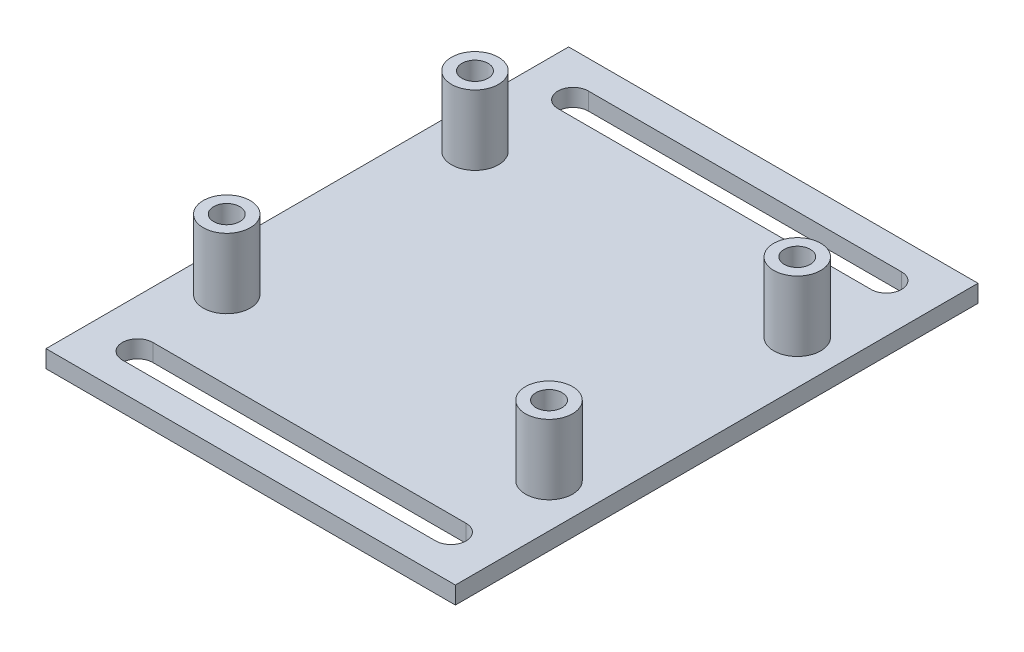
ISO-10303-21;
HEADER;
FILE_DESCRIPTION(('STEP AP214'),'2;1');
FILE_NAME('part.step','',(''),(''),'','','');
FILE_SCHEMA(('AUTOMOTIVE_DESIGN { 1 0 10303 214 1 1 1 1 }'));
ENDSEC;
DATA;
#1=APPLICATION_CONTEXT('core data for automotive mechanical design processes');
#2=APPLICATION_PROTOCOL_DEFINITION('international standard','automotive_design',2000,#1);
#3=PRODUCT_CONTEXT('',#1,'mechanical');
#4=PRODUCT('Part','Part','',(#3));
#5=PRODUCT_RELATED_PRODUCT_CATEGORY('part','',(#4));
#6=PRODUCT_DEFINITION_FORMATION('','',#4);
#7=PRODUCT_DEFINITION_CONTEXT('part definition',#1,'design');
#8=PRODUCT_DEFINITION('design','',#6,#7);
#9=PRODUCT_DEFINITION_SHAPE('','',#8);
#10=(LENGTH_UNIT() NAMED_UNIT(*) SI_UNIT(.MILLI.,.METRE.));
#11=(NAMED_UNIT(*) PLANE_ANGLE_UNIT() SI_UNIT($,.RADIAN.));
#12=(NAMED_UNIT(*) SI_UNIT($,.STERADIAN.) SOLID_ANGLE_UNIT());
#13=UNCERTAINTY_MEASURE_WITH_UNIT(LENGTH_MEASURE(1.E-05),#10,'distance_accuracy_value','');
#14=(GEOMETRIC_REPRESENTATION_CONTEXT(3) GLOBAL_UNCERTAINTY_ASSIGNED_CONTEXT((#13)) GLOBAL_UNIT_ASSIGNED_CONTEXT((#10,
#11,#12)) REPRESENTATION_CONTEXT('',''));
#15=CARTESIAN_POINT('',(0.,0.,0.));
#16=DIRECTION('',(0.,0.,1.));
#17=DIRECTION('',(1.,0.,0.));
#18=AXIS2_PLACEMENT_3D('',#15,#16,#17);
#19=CARTESIAN_POINT('',(0.,2.,0.));
#20=DIRECTION('',(0.,1.,0.));
#21=DIRECTION('',(0.,0.,1.));
#22=AXIS2_PLACEMENT_3D('',#19,#20,#21);
#23=PLANE('',#22);
#24=CARTESIAN_POINT('',(-18.5,2.,14.25));
#25=DIRECTION('',(0.,1.,0.));
#26=DIRECTION('',(0.,0.,1.));
#27=AXIS2_PLACEMENT_3D('',#24,#25,#26);
#28=CIRCLE('',#27,2.7);
#29=CARTESIAN_POINT('',(-18.5,2.,16.95));
#30=VERTEX_POINT('',#29);
#31=EDGE_CURVE('E531',#30,#30,#28,.T.);
#32=ORIENTED_EDGE('',*,*,#31,.F.);
#33=EDGE_LOOP('',(#32));
#34=FACE_BOUND('',#33,.T.);
#35=CARTESIAN_POINT('',(18.5,2.,14.25));
#36=DIRECTION('',(0.,1.,0.));
#37=DIRECTION('',(0.,0.,1.));
#38=AXIS2_PLACEMENT_3D('',#35,#36,#37);
#39=CIRCLE('',#38,2.7);
#40=CARTESIAN_POINT('',(18.5,2.,16.95));
#41=VERTEX_POINT('',#40);
#42=EDGE_CURVE('E542',#41,#41,#39,.T.);
#43=ORIENTED_EDGE('',*,*,#42,.F.);
#44=EDGE_LOOP('',(#43));
#45=FACE_BOUND('',#44,.T.);
#46=CARTESIAN_POINT('',(18.5,2.,-14.25));
#47=DIRECTION('',(0.,1.,0.));
#48=DIRECTION('',(0.,0.,1.));
#49=AXIS2_PLACEMENT_3D('',#46,#47,#48);
#50=CIRCLE('',#49,2.7);
#51=CARTESIAN_POINT('',(18.5,2.,-11.55));
#52=VERTEX_POINT('',#51);
#53=EDGE_CURVE('E551',#52,#52,#50,.T.);
#54=ORIENTED_EDGE('',*,*,#53,.F.);
#55=EDGE_LOOP('',(#54));
#56=FACE_BOUND('',#55,.T.);
#57=CARTESIAN_POINT('',(-18.5,2.,-14.25));
#58=DIRECTION('',(0.,1.,0.));
#59=DIRECTION('',(0.,0.,1.));
#60=AXIS2_PLACEMENT_3D('',#57,#58,#59);
#61=CIRCLE('',#60,2.7);
#62=CARTESIAN_POINT('',(-18.5,2.,-11.55));
#63=VERTEX_POINT('',#62);
#64=EDGE_CURVE('E559',#63,#63,#61,.T.);
#65=ORIENTED_EDGE('',*,*,#64,.F.);
#66=EDGE_LOOP('',(#65));
#67=FACE_BOUND('',#66,.T.);
#68=DIRECTION('',(0.,0.,-1.));
#69=VECTOR('',#68,1.);
#70=CARTESIAN_POINT('',(23.5,2.,-30.));
#71=LINE('',#70,#69);
#72=CARTESIAN_POINT('',(23.5,2.,30.));
#73=VERTEX_POINT('',#72);
#74=CARTESIAN_POINT('',(23.5,2.,-30.));
#75=VERTEX_POINT('',#74);
#76=EDGE_CURVE('E191',#73,#75,#71,.T.);
#77=ORIENTED_EDGE('',*,*,#76,.T.);
#78=DIRECTION('',(-1.,0.,0.));
#79=VECTOR('',#78,1.);
#80=CARTESIAN_POINT('',(-23.5,2.,-30.));
#81=LINE('',#80,#79);
#82=CARTESIAN_POINT('',(-23.5,2.,-30.));
#83=VERTEX_POINT('',#82);
#84=EDGE_CURVE('E194',#75,#83,#81,.T.);
#85=ORIENTED_EDGE('',*,*,#84,.T.);
#86=DIRECTION('',(0.,0.,1.));
#87=VECTOR('',#86,1.);
#88=CARTESIAN_POINT('',(-23.5,2.,-30.));
#89=LINE('',#88,#87);
#90=CARTESIAN_POINT('',(-23.5,2.,30.));
#91=VERTEX_POINT('',#90);
#92=EDGE_CURVE('E197',#83,#91,#89,.T.);
#93=ORIENTED_EDGE('',*,*,#92,.T.);
#94=DIRECTION('',(1.,0.,0.));
#95=VECTOR('',#94,1.);
#96=CARTESIAN_POINT('',(-23.5,2.,30.));
#97=LINE('',#96,#95);
#98=EDGE_CURVE('E199',#91,#73,#97,.T.);
#99=ORIENTED_EDGE('',*,*,#98,.T.);
#100=EDGE_LOOP('',(#77,#85,#93,#99));
#101=FACE_BOUND('',#100,.T.);
#102=DIRECTION('',(1.,0.,0.));
#103=VECTOR('',#102,1.);
#104=CARTESIAN_POINT('',(-17.9824098704289,2.,-23.25));
#105=LINE('',#104,#103);
#106=CARTESIAN_POINT('',(-17.9824098704289,2.,-23.25));
#107=VERTEX_POINT('',#106);
#108=CARTESIAN_POINT('',(17.9824098704289,2.,-23.25));
#109=VERTEX_POINT('',#108);
#110=EDGE_CURVE('E162',#107,#109,#105,.T.);
#111=ORIENTED_EDGE('',*,*,#110,.F.);
#112=CARTESIAN_POINT('',(-17.9824098704289,2.,-25.));
#113=DIRECTION('',(0.,1.,0.));
#114=DIRECTION('',(0.,0.,1.));
#115=AXIS2_PLACEMENT_3D('',#112,#113,#114);
#116=CIRCLE('',#115,1.75);
#117=CARTESIAN_POINT('',(-17.9824098704289,2.,-26.75));
#118=VERTEX_POINT('',#117);
#119=EDGE_CURVE('E160',#118,#107,#116,.T.);
#120=ORIENTED_EDGE('',*,*,#119,.F.);
#121=DIRECTION('',(-1.,0.,0.));
#122=VECTOR('',#121,1.);
#123=CARTESIAN_POINT('',(-17.9824098704289,2.,-26.75));
#124=LINE('',#123,#122);
#125=CARTESIAN_POINT('',(17.9824098704289,2.,-26.75));
#126=VERTEX_POINT('',#125);
#127=EDGE_CURVE('E168',#126,#118,#124,.T.);
#128=ORIENTED_EDGE('',*,*,#127,.F.);
#129=CARTESIAN_POINT('',(17.9824098704289,2.,-25.));
#130=DIRECTION('',(0.,1.,0.));
#131=DIRECTION('',(0.,0.,1.));
#132=AXIS2_PLACEMENT_3D('',#129,#130,#131);
#133=CIRCLE('',#132,1.75);
#134=EDGE_CURVE('E165',#109,#126,#133,.T.);
#135=ORIENTED_EDGE('',*,*,#134,.F.);
#136=EDGE_LOOP('',(#111,#120,#128,#135));
#137=FACE_BOUND('',#136,.T.);
#138=DIRECTION('',(1.,0.,0.));
#139=VECTOR('',#138,1.);
#140=CARTESIAN_POINT('',(-17.9824098704289,2.,26.75));
#141=LINE('',#140,#139);
#142=CARTESIAN_POINT('',(-17.9824098704289,2.,26.75));
#143=VERTEX_POINT('',#142);
#144=CARTESIAN_POINT('',(17.9824098704289,2.,26.75));
#145=VERTEX_POINT('',#144);
#146=EDGE_CURVE('E130',#143,#145,#141,.T.);
#147=ORIENTED_EDGE('',*,*,#146,.F.);
#148=CARTESIAN_POINT('',(-17.9824098704289,2.,25.));
#149=DIRECTION('',(0.,1.,0.));
#150=DIRECTION('',(0.,0.,1.));
#151=AXIS2_PLACEMENT_3D('',#148,#149,#150);
#152=CIRCLE('',#151,1.75);
#153=CARTESIAN_POINT('',(-17.9824098704289,2.,23.25));
#154=VERTEX_POINT('',#153);
#155=EDGE_CURVE('E122',#154,#143,#152,.T.);
#156=ORIENTED_EDGE('',*,*,#155,.F.);
#157=DIRECTION('',(-1.,0.,0.));
#158=VECTOR('',#157,1.);
#159=CARTESIAN_POINT('',(-17.9824098704289,2.,23.25));
#160=LINE('',#159,#158);
#161=CARTESIAN_POINT('',(17.9824098704289,2.,23.25));
#162=VERTEX_POINT('',#161);
#163=EDGE_CURVE('E144',#162,#154,#160,.T.);
#164=ORIENTED_EDGE('',*,*,#163,.F.);
#165=CARTESIAN_POINT('',(17.9824098704289,2.,25.));
#166=DIRECTION('',(0.,1.,0.));
#167=DIRECTION('',(0.,0.,1.));
#168=AXIS2_PLACEMENT_3D('',#165,#166,#167);
#169=CIRCLE('',#168,1.75);
#170=EDGE_CURVE('E142',#145,#162,#169,.T.);
#171=ORIENTED_EDGE('',*,*,#170,.F.);
#172=EDGE_LOOP('',(#147,#156,#164,#171));
#173=FACE_BOUND('',#172,.T.);
#174=ADVANCED_FACE('F33',(#34,#45,#56,#67,#101,#137,#173),#23,.T.);
#175=CARTESIAN_POINT('',(0.,0.,0.));
#176=DIRECTION('',(0.,1.,0.));
#177=DIRECTION('',(0.,0.,1.));
#178=AXIS2_PLACEMENT_3D('',#175,#176,#177);
#179=PLANE('',#178);
#180=CARTESIAN_POINT('',(-17.9824098704289,0.,-25.));
#181=DIRECTION('',(0.,1.,0.));
#182=DIRECTION('',(0.,0.,1.));
#183=AXIS2_PLACEMENT_3D('',#180,#181,#182);
#184=CIRCLE('',#183,1.75);
#185=CARTESIAN_POINT('',(-17.9824098704289,0.,-26.75));
#186=VERTEX_POINT('',#185);
#187=CARTESIAN_POINT('',(-17.9824098704289,0.,-23.25));
#188=VERTEX_POINT('',#187);
#189=EDGE_CURVE('E138',#186,#188,#184,.T.);
#190=ORIENTED_EDGE('',*,*,#189,.T.);
#191=DIRECTION('',(1.,0.,0.));
#192=VECTOR('',#191,1.);
#193=CARTESIAN_POINT('',(-17.9824098704289,0.,-23.25));
#194=LINE('',#193,#192);
#195=CARTESIAN_POINT('',(17.9824098704289,0.,-23.25));
#196=VERTEX_POINT('',#195);
#197=EDGE_CURVE('E173',#188,#196,#194,.T.);
#198=ORIENTED_EDGE('',*,*,#197,.T.);
#199=CARTESIAN_POINT('',(17.9824098704289,0.,-25.));
#200=DIRECTION('',(0.,1.,0.));
#201=DIRECTION('',(0.,0.,1.));
#202=AXIS2_PLACEMENT_3D('',#199,#200,#201);
#203=CIRCLE('',#202,1.75);
#204=CARTESIAN_POINT('',(17.9824098704289,0.,-26.75));
#205=VERTEX_POINT('',#204);
#206=EDGE_CURVE('E176',#196,#205,#203,.T.);
#207=ORIENTED_EDGE('',*,*,#206,.T.);
#208=DIRECTION('',(-1.,0.,0.));
#209=VECTOR('',#208,1.);
#210=CARTESIAN_POINT('',(-17.9824098704289,0.,-26.75));
#211=LINE('',#210,#209);
#212=EDGE_CURVE('E163',#205,#186,#211,.T.);
#213=ORIENTED_EDGE('',*,*,#212,.T.);
#214=EDGE_LOOP('',(#190,#198,#207,#213));
#215=FACE_BOUND('',#214,.T.);
#216=DIRECTION('',(0.,0.,-1.));
#217=VECTOR('',#216,1.);
#218=CARTESIAN_POINT('',(23.5,0.,-30.));
#219=LINE('',#218,#217);
#220=CARTESIAN_POINT('',(23.5,0.,30.));
#221=VERTEX_POINT('',#220);
#222=CARTESIAN_POINT('',(23.5,0.,-30.));
#223=VERTEX_POINT('',#222);
#224=EDGE_CURVE('E190',#221,#223,#219,.T.);
#225=ORIENTED_EDGE('',*,*,#224,.F.);
#226=DIRECTION('',(1.,0.,0.));
#227=VECTOR('',#226,1.);
#228=CARTESIAN_POINT('',(-23.5,0.,30.));
#229=LINE('',#228,#227);
#230=CARTESIAN_POINT('',(-23.5,0.,30.));
#231=VERTEX_POINT('',#230);
#232=EDGE_CURVE('E195',#231,#221,#229,.T.);
#233=ORIENTED_EDGE('',*,*,#232,.F.);
#234=DIRECTION('',(0.,0.,1.));
#235=VECTOR('',#234,1.);
#236=CARTESIAN_POINT('',(-23.5,0.,-30.));
#237=LINE('',#236,#235);
#238=CARTESIAN_POINT('',(-23.5,0.,-30.));
#239=VERTEX_POINT('',#238);
#240=EDGE_CURVE('E206',#239,#231,#237,.T.);
#241=ORIENTED_EDGE('',*,*,#240,.F.);
#242=DIRECTION('',(-1.,0.,0.));
#243=VECTOR('',#242,1.);
#244=CARTESIAN_POINT('',(-23.5,0.,-30.));
#245=LINE('',#244,#243);
#246=EDGE_CURVE('E204',#223,#239,#245,.T.);
#247=ORIENTED_EDGE('',*,*,#246,.F.);
#248=EDGE_LOOP('',(#225,#233,#241,#247));
#249=FACE_BOUND('',#248,.T.);
#250=CARTESIAN_POINT('',(-17.9824098704289,0.,25.));
#251=DIRECTION('',(0.,1.,0.));
#252=DIRECTION('',(0.,0.,1.));
#253=AXIS2_PLACEMENT_3D('',#250,#251,#252);
#254=CIRCLE('',#253,1.75);
#255=CARTESIAN_POINT('',(-17.9824098704289,0.,23.25));
#256=VERTEX_POINT('',#255);
#257=CARTESIAN_POINT('',(-17.9824098704289,0.,26.75));
#258=VERTEX_POINT('',#257);
#259=EDGE_CURVE('E56',#256,#258,#254,.T.);
#260=ORIENTED_EDGE('',*,*,#259,.T.);
#261=DIRECTION('',(1.,0.,0.));
#262=VECTOR('',#261,1.);
#263=CARTESIAN_POINT('',(-17.9824098704289,0.,26.75));
#264=LINE('',#263,#262);
#265=CARTESIAN_POINT('',(17.9824098704289,0.,26.75));
#266=VERTEX_POINT('',#265);
#267=EDGE_CURVE('E137',#258,#266,#264,.T.);
#268=ORIENTED_EDGE('',*,*,#267,.T.);
#269=CARTESIAN_POINT('',(17.9824098704289,0.,25.));
#270=DIRECTION('',(0.,1.,0.));
#271=DIRECTION('',(0.,0.,1.));
#272=AXIS2_PLACEMENT_3D('',#269,#270,#271);
#273=CIRCLE('',#272,1.75);
#274=CARTESIAN_POINT('',(17.9824098704289,0.,23.25));
#275=VERTEX_POINT('',#274);
#276=EDGE_CURVE('E152',#266,#275,#273,.T.);
#277=ORIENTED_EDGE('',*,*,#276,.T.);
#278=DIRECTION('',(-1.,0.,0.));
#279=VECTOR('',#278,1.);
#280=CARTESIAN_POINT('',(-17.9824098704289,0.,23.25));
#281=LINE('',#280,#279);
#282=EDGE_CURVE('E131',#275,#256,#281,.T.);
#283=ORIENTED_EDGE('',*,*,#282,.T.);
#284=EDGE_LOOP('',(#260,#268,#277,#283));
#285=FACE_BOUND('',#284,.T.);
#286=ADVANCED_FACE('F257',(#215,#249,#285),#179,.F.);
#287=CARTESIAN_POINT('',(23.5,2.,-30.));
#288=DIRECTION('',(-1.,0.,0.));
#289=DIRECTION('',(0.,0.,1.));
#290=AXIS2_PLACEMENT_3D('',#287,#288,#289);
#291=PLANE('',#290);
#292=ORIENTED_EDGE('',*,*,#224,.T.);
#293=DIRECTION('',(0.,-1.,0.));
#294=VECTOR('',#293,1.);
#295=CARTESIAN_POINT('',(23.5,2.,-30.));
#296=LINE('',#295,#294);
#297=EDGE_CURVE('E217',#75,#223,#296,.T.);
#298=ORIENTED_EDGE('',*,*,#297,.F.);
#299=ORIENTED_EDGE('',*,*,#76,.F.);
#300=DIRECTION('',(0.,-1.,0.));
#301=VECTOR('',#300,1.);
#302=CARTESIAN_POINT('',(23.5,2.,30.));
#303=LINE('',#302,#301);
#304=EDGE_CURVE('E201',#73,#221,#303,.T.);
#305=ORIENTED_EDGE('',*,*,#304,.T.);
#306=EDGE_LOOP('',(#292,#298,#299,#305));
#307=FACE_BOUND('',#306,.T.);
#308=ADVANCED_FACE('F35',(#307),#291,.F.);
#309=CARTESIAN_POINT('',(-23.5,2.,-30.));
#310=DIRECTION('',(0.,0.,1.));
#311=DIRECTION('',(1.,0.,0.));
#312=AXIS2_PLACEMENT_3D('',#309,#310,#311);
#313=PLANE('',#312);
#314=ORIENTED_EDGE('',*,*,#246,.T.);
#315=DIRECTION('',(0.,-1.,0.));
#316=VECTOR('',#315,1.);
#317=CARTESIAN_POINT('',(-23.5,2.,-30.));
#318=LINE('',#317,#316);
#319=EDGE_CURVE('E214',#83,#239,#318,.T.);
#320=ORIENTED_EDGE('',*,*,#319,.F.);
#321=ORIENTED_EDGE('',*,*,#84,.F.);
#322=ORIENTED_EDGE('',*,*,#297,.T.);
#323=EDGE_LOOP('',(#314,#320,#321,#322));
#324=FACE_BOUND('',#323,.T.);
#325=ADVANCED_FACE('F351',(#324),#313,.F.);
#326=CARTESIAN_POINT('',(-23.5,2.,-30.));
#327=DIRECTION('',(1.,0.,0.));
#328=DIRECTION('',(0.,0.,-1.));
#329=AXIS2_PLACEMENT_3D('',#326,#327,#328);
#330=PLANE('',#329);
#331=ORIENTED_EDGE('',*,*,#240,.T.);
#332=DIRECTION('',(0.,-1.,0.));
#333=VECTOR('',#332,1.);
#334=CARTESIAN_POINT('',(-23.5,2.,30.));
#335=LINE('',#334,#333);
#336=EDGE_CURVE('E211',#91,#231,#335,.T.);
#337=ORIENTED_EDGE('',*,*,#336,.F.);
#338=ORIENTED_EDGE('',*,*,#92,.F.);
#339=ORIENTED_EDGE('',*,*,#319,.T.);
#340=EDGE_LOOP('',(#331,#337,#338,#339));
#341=FACE_BOUND('',#340,.T.);
#342=ADVANCED_FACE('F322',(#341),#330,.F.);
#343=CARTESIAN_POINT('',(-23.5,2.,30.));
#344=DIRECTION('',(0.,0.,-1.));
#345=DIRECTION('',(-1.,0.,0.));
#346=AXIS2_PLACEMENT_3D('',#343,#344,#345);
#347=PLANE('',#346);
#348=ORIENTED_EDGE('',*,*,#232,.T.);
#349=ORIENTED_EDGE('',*,*,#304,.F.);
#350=ORIENTED_EDGE('',*,*,#98,.F.);
#351=ORIENTED_EDGE('',*,*,#336,.T.);
#352=EDGE_LOOP('',(#348,#349,#350,#351));
#353=FACE_BOUND('',#352,.T.);
#354=ADVANCED_FACE('F317',(#353),#347,.F.);
#355=CARTESIAN_POINT('',(-17.9824098704289,2.,-25.));
#356=DIRECTION('',(0.,-1.,0.));
#357=DIRECTION('',(0.,0.,-1.));
#358=AXIS2_PLACEMENT_3D('',#355,#356,#357);
#359=CYLINDRICAL_SURFACE('',#358,1.75);
#360=ORIENTED_EDGE('',*,*,#189,.F.);
#361=DIRECTION('',(0.,-1.,0.));
#362=VECTOR('',#361,1.);
#363=CARTESIAN_POINT('',(-17.9824098704289,2.,-26.75));
#364=LINE('',#363,#362);
#365=EDGE_CURVE('E170',#118,#186,#364,.T.);
#366=ORIENTED_EDGE('',*,*,#365,.F.);
#367=ORIENTED_EDGE('',*,*,#119,.T.);
#368=DIRECTION('',(0.,-1.,0.));
#369=VECTOR('',#368,1.);
#370=CARTESIAN_POINT('',(-17.9824098704289,2.,-23.25));
#371=LINE('',#370,#369);
#372=EDGE_CURVE('E187',#107,#188,#371,.T.);
#373=ORIENTED_EDGE('',*,*,#372,.T.);
#374=EDGE_LOOP('',(#360,#366,#367,#373));
#375=FACE_BOUND('',#374,.T.);
#376=ADVANCED_FACE('F314',(#375),#359,.F.);
#377=CARTESIAN_POINT('',(-17.9824098704289,2.,-23.25));
#378=DIRECTION('',(0.,0.,-1.));
#379=DIRECTION('',(-1.,0.,0.));
#380=AXIS2_PLACEMENT_3D('',#377,#378,#379);
#381=PLANE('',#380);
#382=ORIENTED_EDGE('',*,*,#197,.F.);
#383=ORIENTED_EDGE('',*,*,#372,.F.);
#384=ORIENTED_EDGE('',*,*,#110,.T.);
#385=DIRECTION('',(0.,-1.,0.));
#386=VECTOR('',#385,1.);
#387=CARTESIAN_POINT('',(17.9824098704289,2.,-23.25));
#388=LINE('',#387,#386);
#389=EDGE_CURVE('E185',#109,#196,#388,.T.);
#390=ORIENTED_EDGE('',*,*,#389,.T.);
#391=EDGE_LOOP('',(#382,#383,#384,#390));
#392=FACE_BOUND('',#391,.T.);
#393=ADVANCED_FACE('F311',(#392),#381,.T.);
#394=CARTESIAN_POINT('',(17.9824098704289,2.,-25.));
#395=DIRECTION('',(0.,-1.,0.));
#396=DIRECTION('',(0.,0.,-1.));
#397=AXIS2_PLACEMENT_3D('',#394,#395,#396);
#398=CYLINDRICAL_SURFACE('',#397,1.75);
#399=ORIENTED_EDGE('',*,*,#206,.F.);
#400=ORIENTED_EDGE('',*,*,#389,.F.);
#401=ORIENTED_EDGE('',*,*,#134,.T.);
#402=DIRECTION('',(0.,-1.,0.));
#403=VECTOR('',#402,1.);
#404=CARTESIAN_POINT('',(17.9824098704289,2.,-26.75));
#405=LINE('',#404,#403);
#406=EDGE_CURVE('E183',#126,#205,#405,.T.);
#407=ORIENTED_EDGE('',*,*,#406,.T.);
#408=EDGE_LOOP('',(#399,#400,#401,#407));
#409=FACE_BOUND('',#408,.T.);
#410=ADVANCED_FACE('F307',(#409),#398,.F.);
#411=CARTESIAN_POINT('',(-17.9824098704289,2.,-26.75));
#412=DIRECTION('',(0.,0.,1.));
#413=DIRECTION('',(1.,0.,0.));
#414=AXIS2_PLACEMENT_3D('',#411,#412,#413);
#415=PLANE('',#414);
#416=ORIENTED_EDGE('',*,*,#212,.F.);
#417=ORIENTED_EDGE('',*,*,#406,.F.);
#418=ORIENTED_EDGE('',*,*,#127,.T.);
#419=ORIENTED_EDGE('',*,*,#365,.T.);
#420=EDGE_LOOP('',(#416,#417,#418,#419));
#421=FACE_BOUND('',#420,.T.);
#422=ADVANCED_FACE('F304',(#421),#415,.T.);
#423=CARTESIAN_POINT('',(-17.9824098704289,2.,25.));
#424=DIRECTION('',(0.,-1.,0.));
#425=DIRECTION('',(0.,0.,-1.));
#426=AXIS2_PLACEMENT_3D('',#423,#424,#425);
#427=CYLINDRICAL_SURFACE('',#426,1.75);
#428=ORIENTED_EDGE('',*,*,#259,.F.);
#429=DIRECTION('',(0.,-1.,0.));
#430=VECTOR('',#429,1.);
#431=CARTESIAN_POINT('',(-17.9824098704289,2.,23.25));
#432=LINE('',#431,#430);
#433=EDGE_CURVE('E126',#154,#256,#432,.T.);
#434=ORIENTED_EDGE('',*,*,#433,.F.);
#435=ORIENTED_EDGE('',*,*,#155,.T.);
#436=DIRECTION('',(0.,-1.,0.));
#437=VECTOR('',#436,1.);
#438=CARTESIAN_POINT('',(-17.9824098704289,2.,26.75));
#439=LINE('',#438,#437);
#440=EDGE_CURVE('E125',#143,#258,#439,.T.);
#441=ORIENTED_EDGE('',*,*,#440,.T.);
#442=EDGE_LOOP('',(#428,#434,#435,#441));
#443=FACE_BOUND('',#442,.T.);
#444=ADVANCED_FACE('F124',(#443),#427,.F.);
#445=CARTESIAN_POINT('',(-17.9824098704289,2.,26.75));
#446=DIRECTION('',(0.,0.,-1.));
#447=DIRECTION('',(-1.,0.,0.));
#448=AXIS2_PLACEMENT_3D('',#445,#446,#447);
#449=PLANE('',#448);
#450=ORIENTED_EDGE('',*,*,#267,.F.);
#451=ORIENTED_EDGE('',*,*,#440,.F.);
#452=ORIENTED_EDGE('',*,*,#146,.T.);
#453=DIRECTION('',(0.,-1.,0.));
#454=VECTOR('',#453,1.);
#455=CARTESIAN_POINT('',(17.9824098704289,2.,26.75));
#456=LINE('',#455,#454);
#457=EDGE_CURVE('E139',#145,#266,#456,.T.);
#458=ORIENTED_EDGE('',*,*,#457,.T.);
#459=EDGE_LOOP('',(#450,#451,#452,#458));
#460=FACE_BOUND('',#459,.T.);
#461=ADVANCED_FACE('F134',(#460),#449,.T.);
#462=CARTESIAN_POINT('',(17.9824098704289,2.,25.));
#463=DIRECTION('',(0.,-1.,0.));
#464=DIRECTION('',(0.,0.,-1.));
#465=AXIS2_PLACEMENT_3D('',#462,#463,#464);
#466=CYLINDRICAL_SURFACE('',#465,1.75);
#467=ORIENTED_EDGE('',*,*,#276,.F.);
#468=ORIENTED_EDGE('',*,*,#457,.F.);
#469=ORIENTED_EDGE('',*,*,#170,.T.);
#470=DIRECTION('',(0.,-1.,0.));
#471=VECTOR('',#470,1.);
#472=CARTESIAN_POINT('',(17.9824098704289,2.,23.25));
#473=LINE('',#472,#471);
#474=EDGE_CURVE('E48',#162,#275,#473,.T.);
#475=ORIENTED_EDGE('',*,*,#474,.T.);
#476=EDGE_LOOP('',(#467,#468,#469,#475));
#477=FACE_BOUND('',#476,.T.);
#478=ADVANCED_FACE('F296',(#477),#466,.F.);
#479=CARTESIAN_POINT('',(-17.9824098704289,2.,23.25));
#480=DIRECTION('',(0.,0.,1.));
#481=DIRECTION('',(1.,0.,0.));
#482=AXIS2_PLACEMENT_3D('',#479,#480,#481);
#483=PLANE('',#482);
#484=ORIENTED_EDGE('',*,*,#282,.F.);
#485=ORIENTED_EDGE('',*,*,#474,.F.);
#486=ORIENTED_EDGE('',*,*,#163,.T.);
#487=ORIENTED_EDGE('',*,*,#433,.T.);
#488=EDGE_LOOP('',(#484,#485,#486,#487));
#489=FACE_BOUND('',#488,.T.);
#490=ADVANCED_FACE('F291',(#489),#483,.T.);
#491=CARTESIAN_POINT('',(-18.5,10.,-14.25));
#492=DIRECTION('',(0.,1.,0.));
#493=DIRECTION('',(0.,0.,1.));
#494=AXIS2_PLACEMENT_3D('',#491,#492,#493);
#495=PLANE('',#494);
#496=CARTESIAN_POINT('',(-18.5,10.,-14.25));
#497=DIRECTION('',(0.,1.,0.));
#498=DIRECTION('',(0.,0.,1.));
#499=AXIS2_PLACEMENT_3D('',#496,#497,#498);
#500=CIRCLE('',#499,2.7);
#501=CARTESIAN_POINT('',(-18.5,10.,-11.55));
#502=VERTEX_POINT('',#501);
#503=EDGE_CURVE('E150',#502,#502,#500,.T.);
#504=ORIENTED_EDGE('',*,*,#503,.T.);
#505=EDGE_LOOP('',(#504));
#506=FACE_BOUND('',#505,.T.);
#507=CARTESIAN_POINT('',(-18.5,10.,-14.25));
#508=DIRECTION('',(0.,1.,0.));
#509=DIRECTION('',(0.,0.,1.));
#510=AXIS2_PLACEMENT_3D('',#507,#508,#509);
#511=CIRCLE('',#510,1.5);
#512=CARTESIAN_POINT('',(-18.5,10.,-12.75));
#513=VERTEX_POINT('',#512);
#514=EDGE_CURVE('E555',#513,#513,#511,.T.);
#515=ORIENTED_EDGE('',*,*,#514,.F.);
#516=EDGE_LOOP('',(#515));
#517=FACE_BOUND('',#516,.T.);
#518=ADVANCED_FACE('F284',(#506,#517),#495,.T.);
#519=CARTESIAN_POINT('',(-18.5,10.,-14.25));
#520=DIRECTION('',(0.,-1.,0.));
#521=DIRECTION('',(0.,0.,-1.));
#522=AXIS2_PLACEMENT_3D('',#519,#520,#521);
#523=CYLINDRICAL_SURFACE('',#522,2.7);
#524=ORIENTED_EDGE('',*,*,#503,.F.);
#525=EDGE_LOOP('',(#524));
#526=FACE_BOUND('',#525,.T.);
#527=ORIENTED_EDGE('',*,*,#64,.T.);
#528=EDGE_LOOP('',(#527));
#529=FACE_BOUND('',#528,.T.);
#530=ADVANCED_FACE('F276',(#526,#529),#523,.T.);
#531=CARTESIAN_POINT('',(-18.5,10.,-14.25));
#532=DIRECTION('',(0.,-1.,0.));
#533=DIRECTION('',(0.,0.,-1.));
#534=AXIS2_PLACEMENT_3D('',#531,#532,#533);
#535=CYLINDRICAL_SURFACE('',#534,1.5);
#536=ORIENTED_EDGE('',*,*,#514,.T.);
#537=EDGE_LOOP('',(#536));
#538=FACE_BOUND('',#537,.T.);
#539=CARTESIAN_POINT('',(-18.5,2.,-14.25));
#540=DIRECTION('',(0.,1.,0.));
#541=DIRECTION('',(0.,0.,1.));
#542=AXIS2_PLACEMENT_3D('',#539,#540,#541);
#543=CIRCLE('',#542,1.5);
#544=CARTESIAN_POINT('',(-18.5,2.,-12.75));
#545=VERTEX_POINT('',#544);
#546=EDGE_CURVE('E220',#545,#545,#543,.F.);
#547=ORIENTED_EDGE('',*,*,#546,.T.);
#548=EDGE_LOOP('',(#547));
#549=FACE_BOUND('',#548,.T.);
#550=ADVANCED_FACE('F267',(#538,#549),#535,.F.);
#551=ORIENTED_EDGE('',*,*,#546,.F.);
#552=EDGE_LOOP('',(#551));
#553=FACE_BOUND('',#552,.T.);
#554=ADVANCED_FACE('F252',(#553),#23,.T.);
#555=CARTESIAN_POINT('',(18.5,10.,-14.25));
#556=DIRECTION('',(0.,1.,0.));
#557=DIRECTION('',(0.,0.,1.));
#558=AXIS2_PLACEMENT_3D('',#555,#556,#557);
#559=PLANE('',#558);
#560=CARTESIAN_POINT('',(18.5,10.,-14.25));
#561=DIRECTION('',(0.,1.,0.));
#562=DIRECTION('',(0.,0.,1.));
#563=AXIS2_PLACEMENT_3D('',#560,#561,#562);
#564=CIRCLE('',#563,2.7);
#565=CARTESIAN_POINT('',(18.5,10.,-11.55));
#566=VERTEX_POINT('',#565);
#567=EDGE_CURVE('E552',#566,#566,#564,.T.);
#568=ORIENTED_EDGE('',*,*,#567,.T.);
#569=EDGE_LOOP('',(#568));
#570=FACE_BOUND('',#569,.T.);
#571=CARTESIAN_POINT('',(18.5,10.,-14.25));
#572=DIRECTION('',(0.,1.,0.));
#573=DIRECTION('',(0.,0.,1.));
#574=AXIS2_PLACEMENT_3D('',#571,#572,#573);
#575=CIRCLE('',#574,1.5);
#576=CARTESIAN_POINT('',(18.5,10.,-12.75));
#577=VERTEX_POINT('',#576);
#578=EDGE_CURVE('E546',#577,#577,#575,.T.);
#579=ORIENTED_EDGE('',*,*,#578,.F.);
#580=EDGE_LOOP('',(#579));
#581=FACE_BOUND('',#580,.T.);
#582=ADVANCED_FACE('F266',(#570,#581),#559,.T.);
#583=CARTESIAN_POINT('',(18.5,10.,-14.25));
#584=DIRECTION('',(0.,-1.,0.));
#585=DIRECTION('',(0.,0.,-1.));
#586=AXIS2_PLACEMENT_3D('',#583,#584,#585);
#587=CYLINDRICAL_SURFACE('',#586,2.7);
#588=ORIENTED_EDGE('',*,*,#567,.F.);
#589=EDGE_LOOP('',(#588));
#590=FACE_BOUND('',#589,.T.);
#591=ORIENTED_EDGE('',*,*,#53,.T.);
#592=EDGE_LOOP('',(#591));
#593=FACE_BOUND('',#592,.T.);
#594=ADVANCED_FACE('F273',(#590,#593),#587,.T.);
#595=CARTESIAN_POINT('',(18.5,10.,-14.25));
#596=DIRECTION('',(0.,-1.,0.));
#597=DIRECTION('',(0.,0.,-1.));
#598=AXIS2_PLACEMENT_3D('',#595,#596,#597);
#599=CYLINDRICAL_SURFACE('',#598,1.5);
#600=ORIENTED_EDGE('',*,*,#578,.T.);
#601=EDGE_LOOP('',(#600));
#602=FACE_BOUND('',#601,.T.);
#603=CARTESIAN_POINT('',(18.5,2.,-14.25));
#604=DIRECTION('',(0.,1.,0.));
#605=DIRECTION('',(0.,0.,1.));
#606=AXIS2_PLACEMENT_3D('',#603,#604,#605);
#607=CIRCLE('',#606,1.5);
#608=CARTESIAN_POINT('',(18.5,2.,-12.75));
#609=VERTEX_POINT('',#608);
#610=EDGE_CURVE('E223',#609,#609,#607,.F.);
#611=ORIENTED_EDGE('',*,*,#610,.T.);
#612=EDGE_LOOP('',(#611));
#613=FACE_BOUND('',#612,.T.);
#614=ADVANCED_FACE('F250',(#602,#613),#599,.F.);
#615=ORIENTED_EDGE('',*,*,#610,.F.);
#616=EDGE_LOOP('',(#615));
#617=FACE_BOUND('',#616,.T.);
#618=ADVANCED_FACE('F234',(#617),#23,.T.);
#619=CARTESIAN_POINT('',(18.5,10.,14.25));
#620=DIRECTION('',(0.,1.,0.));
#621=DIRECTION('',(0.,0.,1.));
#622=AXIS2_PLACEMENT_3D('',#619,#620,#621);
#623=PLANE('',#622);
#624=CARTESIAN_POINT('',(18.5,10.,14.25));
#625=DIRECTION('',(0.,1.,0.));
#626=DIRECTION('',(0.,0.,1.));
#627=AXIS2_PLACEMENT_3D('',#624,#625,#626);
#628=CIRCLE('',#627,2.7);
#629=CARTESIAN_POINT('',(18.5,10.,16.95));
#630=VERTEX_POINT('',#629);
#631=EDGE_CURVE('E543',#630,#630,#628,.T.);
#632=ORIENTED_EDGE('',*,*,#631,.T.);
#633=EDGE_LOOP('',(#632));
#634=FACE_BOUND('',#633,.T.);
#635=CARTESIAN_POINT('',(18.5,10.,14.25));
#636=DIRECTION('',(0.,1.,0.));
#637=DIRECTION('',(0.,0.,1.));
#638=AXIS2_PLACEMENT_3D('',#635,#636,#637);
#639=CIRCLE('',#638,1.5);
#640=CARTESIAN_POINT('',(18.5,10.,15.75));
#641=VERTEX_POINT('',#640);
#642=EDGE_CURVE('E538',#641,#641,#639,.T.);
#643=ORIENTED_EDGE('',*,*,#642,.F.);
#644=EDGE_LOOP('',(#643));
#645=FACE_BOUND('',#644,.T.);
#646=ADVANCED_FACE('F249',(#634,#645),#623,.T.);
#647=CARTESIAN_POINT('',(18.5,10.,14.25));
#648=DIRECTION('',(0.,-1.,0.));
#649=DIRECTION('',(0.,0.,-1.));
#650=AXIS2_PLACEMENT_3D('',#647,#648,#649);
#651=CYLINDRICAL_SURFACE('',#650,2.7);
#652=ORIENTED_EDGE('',*,*,#631,.F.);
#653=EDGE_LOOP('',(#652));
#654=FACE_BOUND('',#653,.T.);
#655=ORIENTED_EDGE('',*,*,#42,.T.);
#656=EDGE_LOOP('',(#655));
#657=FACE_BOUND('',#656,.T.);
#658=ADVANCED_FACE('F243',(#654,#657),#651,.T.);
#659=CARTESIAN_POINT('',(18.5,10.,14.25));
#660=DIRECTION('',(0.,-1.,0.));
#661=DIRECTION('',(0.,0.,-1.));
#662=AXIS2_PLACEMENT_3D('',#659,#660,#661);
#663=CYLINDRICAL_SURFACE('',#662,1.5);
#664=ORIENTED_EDGE('',*,*,#642,.T.);
#665=EDGE_LOOP('',(#664));
#666=FACE_BOUND('',#665,.T.);
#667=CARTESIAN_POINT('',(18.5,2.,14.25));
#668=DIRECTION('',(0.,1.,0.));
#669=DIRECTION('',(0.,0.,1.));
#670=AXIS2_PLACEMENT_3D('',#667,#668,#669);
#671=CIRCLE('',#670,1.5);
#672=CARTESIAN_POINT('',(18.5,2.,15.75));
#673=VERTEX_POINT('',#672);
#674=EDGE_CURVE('E41',#673,#673,#671,.F.);
#675=ORIENTED_EDGE('',*,*,#674,.T.);
#676=EDGE_LOOP('',(#675));
#677=FACE_BOUND('',#676,.T.);
#678=ADVANCED_FACE('F228',(#666,#677),#663,.F.);
#679=ORIENTED_EDGE('',*,*,#674,.F.);
#680=EDGE_LOOP('',(#679));
#681=FACE_BOUND('',#680,.T.);
#682=ADVANCED_FACE('F230',(#681),#23,.T.);
#683=CARTESIAN_POINT('',(-18.5,10.,14.25));
#684=DIRECTION('',(0.,1.,0.));
#685=DIRECTION('',(0.,0.,1.));
#686=AXIS2_PLACEMENT_3D('',#683,#684,#685);
#687=PLANE('',#686);
#688=CARTESIAN_POINT('',(-18.5,10.,14.25));
#689=DIRECTION('',(0.,1.,0.));
#690=DIRECTION('',(0.,0.,1.));
#691=AXIS2_PLACEMENT_3D('',#688,#689,#690);
#692=CIRCLE('',#691,2.7);
#693=CARTESIAN_POINT('',(-18.5,10.,16.95));
#694=VERTEX_POINT('',#693);
#695=EDGE_CURVE('E534',#694,#694,#692,.T.);
#696=ORIENTED_EDGE('',*,*,#695,.T.);
#697=EDGE_LOOP('',(#696));
#698=FACE_BOUND('',#697,.T.);
#699=CARTESIAN_POINT('',(-18.5,10.,14.25));
#700=DIRECTION('',(0.,1.,0.));
#701=DIRECTION('',(0.,0.,1.));
#702=AXIS2_PLACEMENT_3D('',#699,#700,#701);
#703=CIRCLE('',#702,1.5);
#704=CARTESIAN_POINT('',(-18.5,10.,15.75));
#705=VERTEX_POINT('',#704);
#706=EDGE_CURVE('E528',#705,#705,#703,.T.);
#707=ORIENTED_EDGE('',*,*,#706,.F.);
#708=EDGE_LOOP('',(#707));
#709=FACE_BOUND('',#708,.T.);
#710=ADVANCED_FACE('F232',(#698,#709),#687,.T.);
#711=CARTESIAN_POINT('',(-18.5,10.,14.25));
#712=DIRECTION('',(0.,-1.,0.));
#713=DIRECTION('',(0.,0.,-1.));
#714=AXIS2_PLACEMENT_3D('',#711,#712,#713);
#715=CYLINDRICAL_SURFACE('',#714,2.7);
#716=ORIENTED_EDGE('',*,*,#695,.F.);
#717=EDGE_LOOP('',(#716));
#718=FACE_BOUND('',#717,.T.);
#719=ORIENTED_EDGE('',*,*,#31,.T.);
#720=EDGE_LOOP('',(#719));
#721=FACE_BOUND('',#720,.T.);
#722=ADVANCED_FACE('F240',(#718,#721),#715,.T.);
#723=CARTESIAN_POINT('',(-18.5,10.,14.25));
#724=DIRECTION('',(0.,-1.,0.));
#725=DIRECTION('',(0.,0.,-1.));
#726=AXIS2_PLACEMENT_3D('',#723,#724,#725);
#727=CYLINDRICAL_SURFACE('',#726,1.5);
#728=ORIENTED_EDGE('',*,*,#706,.T.);
#729=EDGE_LOOP('',(#728));
#730=FACE_BOUND('',#729,.T.);
#731=CARTESIAN_POINT('',(-18.5,2.,14.25));
#732=DIRECTION('',(0.,1.,0.));
#733=DIRECTION('',(0.,0.,1.));
#734=AXIS2_PLACEMENT_3D('',#731,#732,#733);
#735=CIRCLE('',#734,1.5);
#736=CARTESIAN_POINT('',(-18.5,2.,15.75));
#737=VERTEX_POINT('',#736);
#738=EDGE_CURVE('E11',#737,#737,#735,.F.);
#739=ORIENTED_EDGE('',*,*,#738,.T.);
#740=EDGE_LOOP('',(#739));
#741=FACE_BOUND('',#740,.T.);
#742=ADVANCED_FACE('F254',(#730,#741),#727,.F.);
#743=ORIENTED_EDGE('',*,*,#738,.F.);
#744=EDGE_LOOP('',(#743));
#745=FACE_BOUND('',#744,.T.);
#746=ADVANCED_FACE('F235',(#745),#23,.T.);
#747=CLOSED_SHELL('',(#174,#286,#308,#325,#342,#354,#376,#393,#410,#422,#444,#461,#478,#490,
#518,#530,#550,#554,#582,#594,#614,#618,#646,#658,#678,#682,#710,#722,#742,#746));
#748=MANIFOLD_SOLID_BREP('B2',#747);
#749=ADVANCED_BREP_SHAPE_REPRESENTATION('',(#18,#748),#14);
#750=SHAPE_DEFINITION_REPRESENTATION(#9,#749);
ENDSEC;
END-ISO-10303-21;
